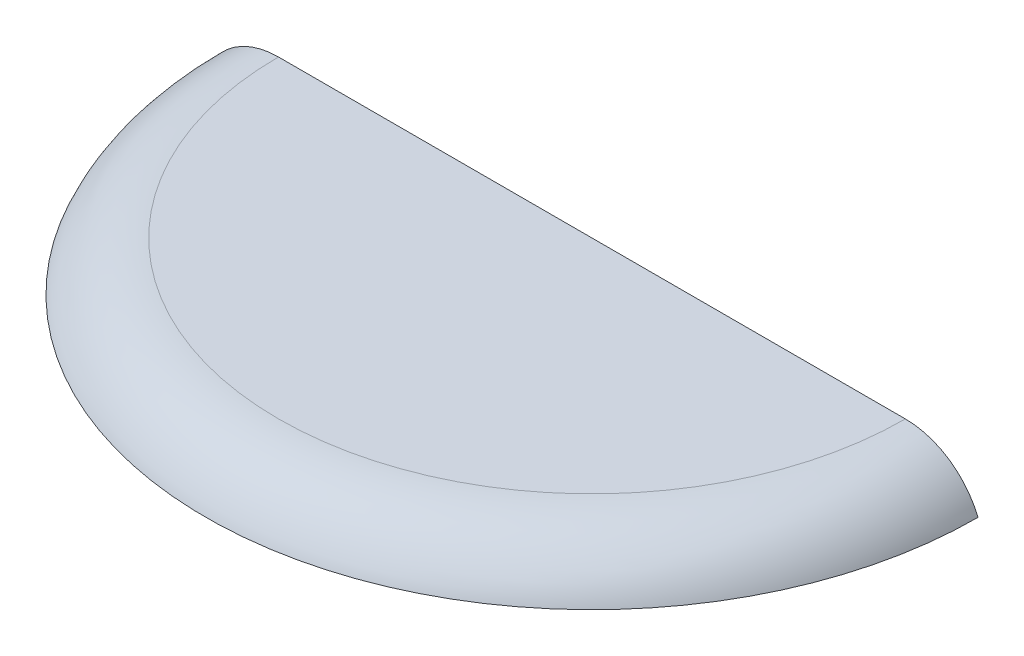
ISO-10303-21;
HEADER;
FILE_DESCRIPTION(('STEP AP214'),'2;1');
FILE_NAME('part.step','',(''),(''),'','','');
FILE_SCHEMA(('AUTOMOTIVE_DESIGN { 1 0 10303 214 1 1 1 1 }'));
ENDSEC;
DATA;
#1=APPLICATION_CONTEXT('core data for automotive mechanical design processes');
#2=APPLICATION_PROTOCOL_DEFINITION('international standard','automotive_design',2000,#1);
#3=PRODUCT_CONTEXT('',#1,'mechanical');
#4=PRODUCT('Part','Part','',(#3));
#5=PRODUCT_RELATED_PRODUCT_CATEGORY('part','',(#4));
#6=PRODUCT_DEFINITION_FORMATION('','',#4);
#7=PRODUCT_DEFINITION_CONTEXT('part definition',#1,'design');
#8=PRODUCT_DEFINITION('design','',#6,#7);
#9=PRODUCT_DEFINITION_SHAPE('','',#8);
#10=(LENGTH_UNIT() NAMED_UNIT(*) SI_UNIT(.MILLI.,.METRE.));
#11=(NAMED_UNIT(*) PLANE_ANGLE_UNIT() SI_UNIT($,.RADIAN.));
#12=(NAMED_UNIT(*) SI_UNIT($,.STERADIAN.) SOLID_ANGLE_UNIT());
#13=UNCERTAINTY_MEASURE_WITH_UNIT(LENGTH_MEASURE(1.E-05),#10,'distance_accuracy_value','');
#14=(GEOMETRIC_REPRESENTATION_CONTEXT(3) GLOBAL_UNCERTAINTY_ASSIGNED_CONTEXT((#13)) GLOBAL_UNIT_ASSIGNED_CONTEXT((#10,
#11,#12)) REPRESENTATION_CONTEXT('',''));
#15=CARTESIAN_POINT('',(0.,0.,0.));
#16=DIRECTION('',(0.,0.,1.));
#17=DIRECTION('',(1.,0.,0.));
#18=AXIS2_PLACEMENT_3D('',#15,#16,#17);
#19=CARTESIAN_POINT('',(0.,58.4278760968653,0.));
#20=DIRECTION('',(0.,1.,0.));
#21=DIRECTION('',(0.,0.,1.));
#22=AXIS2_PLACEMENT_3D('',#19,#20,#21);
#23=PLANE('',#22);
#24=CARTESIAN_POINT('',(0.,58.4278760968653,0.));
#25=DIRECTION('',(0.,1.,0.));
#26=DIRECTION('',(0.,0.,1.));
#27=AXIS2_PLACEMENT_3D('',#24,#25,#26);
#28=CIRCLE('',#27,39.4161984870957);
#29=CARTESIAN_POINT('',(39.4161984870957,58.4278760968653,0.));
#30=VERTEX_POINT('',#29);
#31=CARTESIAN_POINT('',(-39.4161984870957,58.4278760968653,2.77280175019557E-13));
#32=VERTEX_POINT('',#31);
#33=EDGE_CURVE('E46',#30,#32,#28,.F.);
#34=ORIENTED_EDGE('',*,*,#33,.T.);
#35=DIRECTION('',(-1.,0.,0.));
#36=VECTOR('',#35,1.);
#37=CARTESIAN_POINT('',(21.,58.4278760968653,0.));
#38=LINE('',#37,#36);
#39=EDGE_CURVE('E70',#30,#32,#38,.T.);
#40=ORIENTED_EDGE('',*,*,#39,.F.);
#41=EDGE_LOOP('',(#34,#40));
#42=FACE_BOUND('',#41,.T.);
#43=ADVANCED_FACE('F43',(#42),#23,.F.);
#44=CARTESIAN_POINT('',(0.,60.9278760968653,15.));
#45=DIRECTION('',(0.,0.,-1.));
#46=DIRECTION('',(-1.,0.,0.));
#47=AXIS2_PLACEMENT_3D('',#44,#45,#46);
#48=PLANE('',#47);
#49=CARTESIAN_POINT('',(0.,60.9278760968653,15.));
#50=DIRECTION('',(0.,0.,-1.));
#51=DIRECTION('',(-1.,0.,0.));
#52=AXIS2_PLACEMENT_3D('',#49,#50,#51);
#53=CIRCLE('',#52,1.);
#54=CARTESIAN_POINT('',(-1.,60.9278760968653,15.));
#55=VERTEX_POINT('',#54);
#56=EDGE_CURVE('E52',#55,#55,#53,.T.);
#57=ORIENTED_EDGE('',*,*,#56,.T.);
#58=EDGE_LOOP('',(#57));
#59=FACE_BOUND('',#58,.T.);
#60=ADVANCED_FACE('F142',(#59),#48,.T.);
#61=CARTESIAN_POINT('',(-30.4161984870957,60.9278760968653,15.));
#62=DIRECTION('',(0.,0.,-1.));
#63=DIRECTION('',(-1.,0.,0.));
#64=AXIS2_PLACEMENT_3D('',#61,#62,#63);
#65=PLANE('',#64);
#66=CARTESIAN_POINT('',(-30.4161984870957,60.9278760968653,15.));
#67=DIRECTION('',(0.,0.,-1.));
#68=DIRECTION('',(-1.,0.,0.));
#69=AXIS2_PLACEMENT_3D('',#66,#67,#68);
#70=CIRCLE('',#69,0.999999999999998);
#71=CARTESIAN_POINT('',(-31.4161984870957,60.9278760968653,15.));
#72=VERTEX_POINT('',#71);
#73=EDGE_CURVE('E101',#72,#72,#70,.T.);
#74=ORIENTED_EDGE('',*,*,#73,.T.);
#75=EDGE_LOOP('',(#74));
#76=FACE_BOUND('',#75,.T.);
#77=ADVANCED_FACE('F146',(#76),#65,.T.);
#78=CARTESIAN_POINT('',(30.4161984870957,60.9278760968653,15.));
#79=DIRECTION('',(0.,0.,-1.));
#80=DIRECTION('',(-1.,0.,0.));
#81=AXIS2_PLACEMENT_3D('',#78,#79,#80);
#82=PLANE('',#81);
#83=CARTESIAN_POINT('',(30.4161984870957,60.9278760968653,15.));
#84=DIRECTION('',(0.,0.,-1.));
#85=DIRECTION('',(-1.,0.,0.));
#86=AXIS2_PLACEMENT_3D('',#83,#84,#85);
#87=CIRCLE('',#86,1.);
#88=CARTESIAN_POINT('',(29.4161984870957,60.9278760968653,15.));
#89=VERTEX_POINT('',#88);
#90=EDGE_CURVE('E89',#89,#89,#87,.T.);
#91=ORIENTED_EDGE('',*,*,#90,.T.);
#92=EDGE_LOOP('',(#91));
#93=FACE_BOUND('',#92,.T.);
#94=ADVANCED_FACE('F112',(#93),#82,.T.);
#95=CARTESIAN_POINT('',(0.,63.4278760968653,0.));
#96=DIRECTION('',(0.,1.,0.));
#97=DIRECTION('',(0.,0.,1.));
#98=AXIS2_PLACEMENT_3D('',#95,#96,#97);
#99=PLANE('',#98);
#100=DIRECTION('',(1.,0.,0.));
#101=VECTOR('',#100,1.);
#102=CARTESIAN_POINT('',(0.,63.4278760968653,0.));
#103=LINE('',#102,#101);
#104=CARTESIAN_POINT('',(-32.,63.4278760968653,2.51386656396706E-13));
#105=VERTEX_POINT('',#104);
#106=CARTESIAN_POINT('',(32.,63.4278760968653,0.));
#107=VERTEX_POINT('',#106);
#108=EDGE_CURVE('E59',#105,#107,#103,.T.);
#109=ORIENTED_EDGE('',*,*,#108,.F.);
#110=CARTESIAN_POINT('',(0.,63.4278760968653,0.));
#111=DIRECTION('',(0.,-1.,0.));
#112=DIRECTION('',(0.,0.,-1.));
#113=AXIS2_PLACEMENT_3D('',#110,#111,#112);
#114=CIRCLE('',#113,32.);
#115=EDGE_CURVE('E84',#107,#105,#114,.T.);
#116=ORIENTED_EDGE('',*,*,#115,.F.);
#117=EDGE_LOOP('',(#109,#116));
#118=FACE_BOUND('',#117,.T.);
#119=ADVANCED_FACE('F137',(#118),#99,.T.);
#120=CARTESIAN_POINT('',(0.,55.4278760968653,0.));
#121=DIRECTION('',(0.,-1.,0.));
#122=DIRECTION('',(0.,0.,-1.));
#123=AXIS2_PLACEMENT_3D('',#120,#121,#122);
#124=TOROIDAL_SURFACE('',#123,32.,8.);
#125=ORIENTED_EDGE('',*,*,#33,.F.);
#126=CARTESIAN_POINT('',(32.,55.4278760968653,-1.1172740284298E-13));
#127=DIRECTION('',(0.,0.,1.));
#128=DIRECTION('',(1.,0.,0.));
#129=AXIS2_PLACEMENT_3D('',#126,#127,#128);
#130=CIRCLE('',#129,8.);
#131=EDGE_CURVE('E76',#107,#30,#130,.F.);
#132=ORIENTED_EDGE('',*,*,#131,.F.);
#133=ORIENTED_EDGE('',*,*,#115,.T.);
#134=CARTESIAN_POINT('',(-32.,55.4278760968653,1.1172740284298E-13));
#135=DIRECTION('',(0.,0.,1.));
#136=DIRECTION('',(1.,0.,0.));
#137=AXIS2_PLACEMENT_3D('',#134,#135,#136);
#138=CIRCLE('',#137,8.);
#139=EDGE_CURVE('E74',#32,#105,#138,.F.);
#140=ORIENTED_EDGE('',*,*,#139,.F.);
#141=EDGE_LOOP('',(#125,#132,#133,#140));
#142=FACE_BOUND('',#141,.T.);
#143=ADVANCED_FACE('F83',(#142),#124,.T.);
#144=CARTESIAN_POINT('',(0.,60.9278760968653,15.));
#145=DIRECTION('',(0.,0.,-1.));
#146=DIRECTION('',(-1.,0.,0.));
#147=AXIS2_PLACEMENT_3D('',#144,#145,#146);
#148=CYLINDRICAL_SURFACE('',#147,1.);
#149=ORIENTED_EDGE('',*,*,#56,.F.);
#150=EDGE_LOOP('',(#149));
#151=FACE_BOUND('',#150,.T.);
#152=CARTESIAN_POINT('',(0.,60.9278760968653,0.));
#153=DIRECTION('',(0.,0.,-1.));
#154=DIRECTION('',(-1.,0.,0.));
#155=AXIS2_PLACEMENT_3D('',#152,#153,#154);
#156=CIRCLE('',#155,1.);
#157=CARTESIAN_POINT('',(-1.,60.9278760968653,0.));
#158=VERTEX_POINT('',#157);
#159=EDGE_CURVE('E12',#158,#158,#156,.T.);
#160=ORIENTED_EDGE('',*,*,#159,.T.);
#161=EDGE_LOOP('',(#160));
#162=FACE_BOUND('',#161,.T.);
#163=ADVANCED_FACE('F127',(#151,#162),#148,.F.);
#164=CARTESIAN_POINT('',(-30.4161984870957,60.9278760968653,15.));
#165=DIRECTION('',(0.,0.,-1.));
#166=DIRECTION('',(-1.,0.,0.));
#167=AXIS2_PLACEMENT_3D('',#164,#165,#166);
#168=CYLINDRICAL_SURFACE('',#167,0.999999999999998);
#169=ORIENTED_EDGE('',*,*,#73,.F.);
#170=EDGE_LOOP('',(#169));
#171=FACE_BOUND('',#170,.T.);
#172=CARTESIAN_POINT('',(-30.4161984870957,60.9278760968653,0.));
#173=DIRECTION('',(0.,0.,-1.));
#174=DIRECTION('',(-1.,0.,0.));
#175=AXIS2_PLACEMENT_3D('',#172,#173,#174);
#176=CIRCLE('',#175,0.999999999999998);
#177=CARTESIAN_POINT('',(-31.4161984870957,60.9278760968653,0.));
#178=VERTEX_POINT('',#177);
#179=EDGE_CURVE('E97',#178,#178,#176,.T.);
#180=ORIENTED_EDGE('',*,*,#179,.T.);
#181=EDGE_LOOP('',(#180));
#182=FACE_BOUND('',#181,.T.);
#183=ADVANCED_FACE('F117',(#171,#182),#168,.F.);
#184=CARTESIAN_POINT('',(30.4161984870957,60.9278760968653,15.));
#185=DIRECTION('',(0.,0.,-1.));
#186=DIRECTION('',(-1.,0.,0.));
#187=AXIS2_PLACEMENT_3D('',#184,#185,#186);
#188=CYLINDRICAL_SURFACE('',#187,1.);
#189=ORIENTED_EDGE('',*,*,#90,.F.);
#190=EDGE_LOOP('',(#189));
#191=FACE_BOUND('',#190,.T.);
#192=CARTESIAN_POINT('',(30.4161984870957,60.9278760968653,0.));
#193=DIRECTION('',(0.,0.,-1.));
#194=DIRECTION('',(-1.,0.,0.));
#195=AXIS2_PLACEMENT_3D('',#192,#193,#194);
#196=CIRCLE('',#195,1.);
#197=CARTESIAN_POINT('',(29.4161984870957,60.9278760968653,0.));
#198=VERTEX_POINT('',#197);
#199=EDGE_CURVE('E105',#198,#198,#196,.T.);
#200=ORIENTED_EDGE('',*,*,#199,.T.);
#201=EDGE_LOOP('',(#200));
#202=FACE_BOUND('',#201,.T.);
#203=ADVANCED_FACE('F114',(#191,#202),#188,.F.);
#204=CARTESIAN_POINT('',(21.,73.,0.));
#205=DIRECTION('',(0.,0.,1.));
#206=DIRECTION('',(1.,0.,0.));
#207=AXIS2_PLACEMENT_3D('',#204,#205,#206);
#208=PLANE('',#207);
#209=ORIENTED_EDGE('',*,*,#199,.F.);
#210=EDGE_LOOP('',(#209));
#211=FACE_BOUND('',#210,.T.);
#212=ORIENTED_EDGE('',*,*,#179,.F.);
#213=EDGE_LOOP('',(#212));
#214=FACE_BOUND('',#213,.T.);
#215=ORIENTED_EDGE('',*,*,#159,.F.);
#216=EDGE_LOOP('',(#215));
#217=FACE_BOUND('',#216,.T.);
#218=ORIENTED_EDGE('',*,*,#131,.T.);
#219=ORIENTED_EDGE('',*,*,#39,.T.);
#220=ORIENTED_EDGE('',*,*,#139,.T.);
#221=ORIENTED_EDGE('',*,*,#108,.T.);
#222=EDGE_LOOP('',(#218,#219,#220,#221));
#223=FACE_BOUND('',#222,.T.);
#224=ADVANCED_FACE('F72',(#211,#214,#217,#223),#208,.F.);
#225=CLOSED_SHELL('',(#43,#60,#77,#94,#119,#143,#163,#183,#203,#224));
#226=MANIFOLD_SOLID_BREP('B2',#225);
#227=ADVANCED_BREP_SHAPE_REPRESENTATION('',(#18,#226),#14);
#228=SHAPE_DEFINITION_REPRESENTATION(#9,#227);
ENDSEC;
END-ISO-10303-21;
